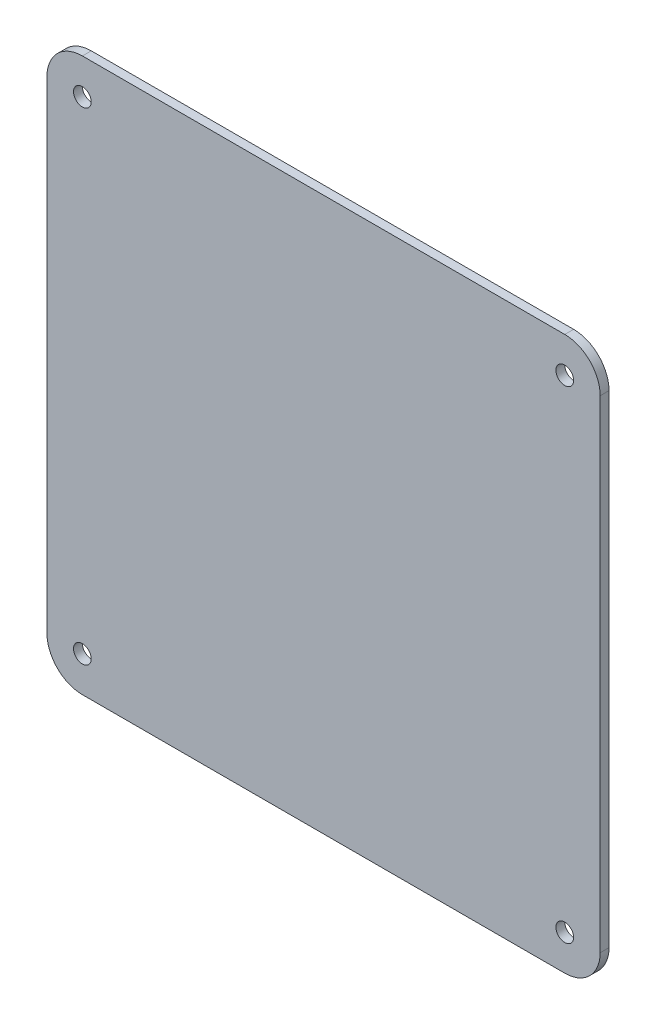
ISO-10303-21;
HEADER;
FILE_DESCRIPTION(('STEP AP214'),'2;1');
FILE_NAME('part.step','',(''),(''),'','','');
FILE_SCHEMA(('AUTOMOTIVE_DESIGN { 1 0 10303 214 1 1 1 1 }'));
ENDSEC;
DATA;
#1=APPLICATION_CONTEXT('core data for automotive mechanical design processes');
#2=APPLICATION_PROTOCOL_DEFINITION('international standard','automotive_design',2000,#1);
#3=PRODUCT_CONTEXT('',#1,'mechanical');
#4=PRODUCT('Part','Part','',(#3));
#5=PRODUCT_RELATED_PRODUCT_CATEGORY('part','',(#4));
#6=PRODUCT_DEFINITION_FORMATION('','',#4);
#7=PRODUCT_DEFINITION_CONTEXT('part definition',#1,'design');
#8=PRODUCT_DEFINITION('design','',#6,#7);
#9=PRODUCT_DEFINITION_SHAPE('','',#8);
#10=(LENGTH_UNIT() NAMED_UNIT(*) SI_UNIT(.MILLI.,.METRE.));
#11=(NAMED_UNIT(*) PLANE_ANGLE_UNIT() SI_UNIT($,.RADIAN.));
#12=(NAMED_UNIT(*) SI_UNIT($,.STERADIAN.) SOLID_ANGLE_UNIT());
#13=UNCERTAINTY_MEASURE_WITH_UNIT(LENGTH_MEASURE(1.E-05),#10,'distance_accuracy_value','');
#14=(GEOMETRIC_REPRESENTATION_CONTEXT(3) GLOBAL_UNCERTAINTY_ASSIGNED_CONTEXT((#13)) GLOBAL_UNIT_ASSIGNED_CONTEXT((#10,
#11,#12)) REPRESENTATION_CONTEXT('',''));
#15=CARTESIAN_POINT('',(0.,0.,0.));
#16=DIRECTION('',(0.,0.,1.));
#17=DIRECTION('',(1.,0.,0.));
#18=AXIS2_PLACEMENT_3D('',#15,#16,#17);
#19=CARTESIAN_POINT('',(-109.,-109.,4.));
#20=DIRECTION('',(0.,0.,1.));
#21=DIRECTION('',(1.,0.,0.));
#22=AXIS2_PLACEMENT_3D('',#19,#20,#21);
#23=PLANE('',#22);
#24=CARTESIAN_POINT('',(109.,109.,4.));
#25=DIRECTION('',(0.,0.,1.));
#26=DIRECTION('',(1.,0.,0.));
#27=AXIS2_PLACEMENT_3D('',#24,#25,#26);
#28=CIRCLE('',#27,4.00000000000001);
#29=CARTESIAN_POINT('',(113.,109.,4.));
#30=VERTEX_POINT('',#29);
#31=EDGE_CURVE('E188',#30,#30,#28,.T.);
#32=ORIENTED_EDGE('',*,*,#31,.F.);
#33=EDGE_LOOP('',(#32));
#34=FACE_BOUND('',#33,.T.);
#35=CARTESIAN_POINT('',(-109.,-109.,4.));
#36=DIRECTION('',(0.,0.,1.));
#37=DIRECTION('',(1.,0.,0.));
#38=AXIS2_PLACEMENT_3D('',#35,#36,#37);
#39=CIRCLE('',#38,4.00000000000001);
#40=CARTESIAN_POINT('',(-105.,-109.,4.));
#41=VERTEX_POINT('',#40);
#42=EDGE_CURVE('E134',#41,#41,#39,.T.);
#43=ORIENTED_EDGE('',*,*,#42,.F.);
#44=EDGE_LOOP('',(#43));
#45=FACE_BOUND('',#44,.T.);
#46=CARTESIAN_POINT('',(-109.,-109.,4.));
#47=DIRECTION('',(0.,0.,1.));
#48=DIRECTION('',(1.,0.,0.));
#49=AXIS2_PLACEMENT_3D('',#46,#47,#48);
#50=CIRCLE('',#49,16.);
#51=CARTESIAN_POINT('',(-125.,-109.,4.));
#52=VERTEX_POINT('',#51);
#53=CARTESIAN_POINT('',(-109.,-125.,4.));
#54=VERTEX_POINT('',#53);
#55=EDGE_CURVE('E145',#52,#54,#50,.T.);
#56=ORIENTED_EDGE('',*,*,#55,.T.);
#57=DIRECTION('',(1.,0.,0.));
#58=VECTOR('',#57,1.);
#59=CARTESIAN_POINT('',(-109.,-125.,4.));
#60=LINE('',#59,#58);
#61=CARTESIAN_POINT('',(109.,-125.,4.));
#62=VERTEX_POINT('',#61);
#63=EDGE_CURVE('E93',#54,#62,#60,.T.);
#64=ORIENTED_EDGE('',*,*,#63,.T.);
#65=CARTESIAN_POINT('',(109.,-109.,4.));
#66=DIRECTION('',(0.,0.,1.));
#67=DIRECTION('',(1.,0.,0.));
#68=AXIS2_PLACEMENT_3D('',#65,#66,#67);
#69=CIRCLE('',#68,16.);
#70=CARTESIAN_POINT('',(125.,-109.,4.));
#71=VERTEX_POINT('',#70);
#72=EDGE_CURVE('E160',#62,#71,#69,.T.);
#73=ORIENTED_EDGE('',*,*,#72,.T.);
#74=DIRECTION('',(0.,1.,0.));
#75=VECTOR('',#74,1.);
#76=CARTESIAN_POINT('',(125.,109.,4.));
#77=LINE('',#76,#75);
#78=CARTESIAN_POINT('',(125.,109.,4.));
#79=VERTEX_POINT('',#78);
#80=EDGE_CURVE('E173',#71,#79,#77,.T.);
#81=ORIENTED_EDGE('',*,*,#80,.T.);
#82=CARTESIAN_POINT('',(109.,109.,4.));
#83=DIRECTION('',(0.,0.,1.));
#84=DIRECTION('',(-1.,0.,0.));
#85=AXIS2_PLACEMENT_3D('',#82,#83,#84);
#86=CIRCLE('',#85,16.);
#87=CARTESIAN_POINT('',(109.,125.,4.));
#88=VERTEX_POINT('',#87);
#89=EDGE_CURVE('E112',#79,#88,#86,.T.);
#90=ORIENTED_EDGE('',*,*,#89,.T.);
#91=DIRECTION('',(-1.,0.,0.));
#92=VECTOR('',#91,1.);
#93=CARTESIAN_POINT('',(-109.,125.,4.));
#94=LINE('',#93,#92);
#95=CARTESIAN_POINT('',(-109.,125.,4.));
#96=VERTEX_POINT('',#95);
#97=EDGE_CURVE('E106',#88,#96,#94,.T.);
#98=ORIENTED_EDGE('',*,*,#97,.T.);
#99=CARTESIAN_POINT('',(-109.,109.,4.));
#100=DIRECTION('',(0.,0.,1.));
#101=DIRECTION('',(1.,0.,0.));
#102=AXIS2_PLACEMENT_3D('',#99,#100,#101);
#103=CIRCLE('',#102,16.);
#104=CARTESIAN_POINT('',(-125.,109.,4.));
#105=VERTEX_POINT('',#104);
#106=EDGE_CURVE('E110',#96,#105,#103,.T.);
#107=ORIENTED_EDGE('',*,*,#106,.T.);
#108=DIRECTION('',(0.,-1.,0.));
#109=VECTOR('',#108,1.);
#110=CARTESIAN_POINT('',(-125.,109.,4.));
#111=LINE('',#110,#109);
#112=EDGE_CURVE('E50',#105,#52,#111,.T.);
#113=ORIENTED_EDGE('',*,*,#112,.T.);
#114=EDGE_LOOP('',(#56,#64,#73,#81,#90,#98,#107,#113));
#115=FACE_BOUND('',#114,.T.);
#116=CARTESIAN_POINT('',(-109.,109.,4.));
#117=DIRECTION('',(0.,0.,1.));
#118=DIRECTION('',(1.,0.,0.));
#119=AXIS2_PLACEMENT_3D('',#116,#117,#118);
#120=CIRCLE('',#119,4.00000000000001);
#121=CARTESIAN_POINT('',(-105.,109.,4.));
#122=VERTEX_POINT('',#121);
#123=EDGE_CURVE('E182',#122,#122,#120,.T.);
#124=ORIENTED_EDGE('',*,*,#123,.F.);
#125=EDGE_LOOP('',(#124));
#126=FACE_BOUND('',#125,.T.);
#127=CARTESIAN_POINT('',(109.,-109.,4.));
#128=DIRECTION('',(0.,0.,1.));
#129=DIRECTION('',(1.,0.,0.));
#130=AXIS2_PLACEMENT_3D('',#127,#128,#129);
#131=CIRCLE('',#130,4.00000000000001);
#132=CARTESIAN_POINT('',(113.,-109.,4.));
#133=VERTEX_POINT('',#132);
#134=EDGE_CURVE('E194',#133,#133,#131,.T.);
#135=ORIENTED_EDGE('',*,*,#134,.F.);
#136=EDGE_LOOP('',(#135));
#137=FACE_BOUND('',#136,.T.);
#138=ADVANCED_FACE('F33',(#34,#45,#115,#126,#137),#23,.T.);
#139=CARTESIAN_POINT('',(-109.,-109.,0.));
#140=DIRECTION('',(0.,0.,1.));
#141=DIRECTION('',(1.,0.,0.));
#142=AXIS2_PLACEMENT_3D('',#139,#140,#141);
#143=PLANE('',#142);
#144=CARTESIAN_POINT('',(-109.,-109.,0.));
#145=DIRECTION('',(0.,0.,1.));
#146=DIRECTION('',(1.,0.,0.));
#147=AXIS2_PLACEMENT_3D('',#144,#145,#146);
#148=CIRCLE('',#147,16.);
#149=CARTESIAN_POINT('',(-125.,-109.,0.));
#150=VERTEX_POINT('',#149);
#151=CARTESIAN_POINT('',(-109.,-125.,0.));
#152=VERTEX_POINT('',#151);
#153=EDGE_CURVE('E130',#150,#152,#148,.T.);
#154=ORIENTED_EDGE('',*,*,#153,.F.);
#155=DIRECTION('',(0.,-1.,0.));
#156=VECTOR('',#155,1.);
#157=CARTESIAN_POINT('',(-125.,109.,0.));
#158=LINE('',#157,#156);
#159=CARTESIAN_POINT('',(-125.,109.,0.));
#160=VERTEX_POINT('',#159);
#161=EDGE_CURVE('E85',#160,#150,#158,.T.);
#162=ORIENTED_EDGE('',*,*,#161,.F.);
#163=CARTESIAN_POINT('',(-109.,109.,0.));
#164=DIRECTION('',(0.,0.,1.));
#165=DIRECTION('',(1.,0.,0.));
#166=AXIS2_PLACEMENT_3D('',#163,#164,#165);
#167=CIRCLE('',#166,16.);
#168=CARTESIAN_POINT('',(-109.,125.,0.));
#169=VERTEX_POINT('',#168);
#170=EDGE_CURVE('E79',#169,#160,#167,.T.);
#171=ORIENTED_EDGE('',*,*,#170,.F.);
#172=DIRECTION('',(-1.,0.,0.));
#173=VECTOR('',#172,1.);
#174=CARTESIAN_POINT('',(-109.,125.,0.));
#175=LINE('',#174,#173);
#176=CARTESIAN_POINT('',(109.,125.,0.));
#177=VERTEX_POINT('',#176);
#178=EDGE_CURVE('E120',#177,#169,#175,.T.);
#179=ORIENTED_EDGE('',*,*,#178,.F.);
#180=CARTESIAN_POINT('',(109.,109.,0.));
#181=DIRECTION('',(0.,0.,1.));
#182=DIRECTION('',(-1.,0.,0.));
#183=AXIS2_PLACEMENT_3D('',#180,#181,#182);
#184=CIRCLE('',#183,16.);
#185=CARTESIAN_POINT('',(125.,109.,0.));
#186=VERTEX_POINT('',#185);
#187=EDGE_CURVE('E140',#186,#177,#184,.T.);
#188=ORIENTED_EDGE('',*,*,#187,.F.);
#189=DIRECTION('',(0.,1.,0.));
#190=VECTOR('',#189,1.);
#191=CARTESIAN_POINT('',(125.,109.,0.));
#192=LINE('',#191,#190);
#193=CARTESIAN_POINT('',(125.,-109.,0.));
#194=VERTEX_POINT('',#193);
#195=EDGE_CURVE('E138',#194,#186,#192,.T.);
#196=ORIENTED_EDGE('',*,*,#195,.F.);
#197=CARTESIAN_POINT('',(109.,-109.,0.));
#198=DIRECTION('',(0.,0.,1.));
#199=DIRECTION('',(1.,0.,0.));
#200=AXIS2_PLACEMENT_3D('',#197,#198,#199);
#201=CIRCLE('',#200,16.);
#202=CARTESIAN_POINT('',(109.,-125.,0.));
#203=VERTEX_POINT('',#202);
#204=EDGE_CURVE('E136',#203,#194,#201,.T.);
#205=ORIENTED_EDGE('',*,*,#204,.F.);
#206=DIRECTION('',(1.,0.,0.));
#207=VECTOR('',#206,1.);
#208=CARTESIAN_POINT('',(-109.,-125.,0.));
#209=LINE('',#208,#207);
#210=EDGE_CURVE('E133',#152,#203,#209,.T.);
#211=ORIENTED_EDGE('',*,*,#210,.F.);
#212=EDGE_LOOP('',(#154,#162,#171,#179,#188,#196,#205,#211));
#213=FACE_BOUND('',#212,.T.);
#214=CARTESIAN_POINT('',(-109.,-109.,0.));
#215=DIRECTION('',(0.,0.,1.));
#216=DIRECTION('',(1.,0.,0.));
#217=AXIS2_PLACEMENT_3D('',#214,#215,#216);
#218=CIRCLE('',#217,4.00000000000001);
#219=CARTESIAN_POINT('',(-105.,-109.,0.));
#220=VERTEX_POINT('',#219);
#221=EDGE_CURVE('E179',#220,#220,#218,.T.);
#222=ORIENTED_EDGE('',*,*,#221,.T.);
#223=EDGE_LOOP('',(#222));
#224=FACE_BOUND('',#223,.T.);
#225=CARTESIAN_POINT('',(-109.,109.,0.));
#226=DIRECTION('',(0.,0.,1.));
#227=DIRECTION('',(1.,0.,0.));
#228=AXIS2_PLACEMENT_3D('',#225,#226,#227);
#229=CIRCLE('',#228,4.00000000000001);
#230=CARTESIAN_POINT('',(-105.,109.,0.));
#231=VERTEX_POINT('',#230);
#232=EDGE_CURVE('E185',#231,#231,#229,.T.);
#233=ORIENTED_EDGE('',*,*,#232,.T.);
#234=EDGE_LOOP('',(#233));
#235=FACE_BOUND('',#234,.T.);
#236=CARTESIAN_POINT('',(109.,109.,0.));
#237=DIRECTION('',(0.,0.,1.));
#238=DIRECTION('',(1.,0.,0.));
#239=AXIS2_PLACEMENT_3D('',#236,#237,#238);
#240=CIRCLE('',#239,4.00000000000001);
#241=CARTESIAN_POINT('',(113.,109.,0.));
#242=VERTEX_POINT('',#241);
#243=EDGE_CURVE('E191',#242,#242,#240,.T.);
#244=ORIENTED_EDGE('',*,*,#243,.T.);
#245=EDGE_LOOP('',(#244));
#246=FACE_BOUND('',#245,.T.);
#247=CARTESIAN_POINT('',(109.,-109.,0.));
#248=DIRECTION('',(0.,0.,1.));
#249=DIRECTION('',(1.,0.,0.));
#250=AXIS2_PLACEMENT_3D('',#247,#248,#249);
#251=CIRCLE('',#250,4.00000000000001);
#252=CARTESIAN_POINT('',(113.,-109.,0.));
#253=VERTEX_POINT('',#252);
#254=EDGE_CURVE('E197',#253,#253,#251,.T.);
#255=ORIENTED_EDGE('',*,*,#254,.T.);
#256=EDGE_LOOP('',(#255));
#257=FACE_BOUND('',#256,.T.);
#258=ADVANCED_FACE('F164',(#213,#224,#235,#246,#257),#143,.F.);
#259=CARTESIAN_POINT('',(-109.,-109.,4.));
#260=DIRECTION('',(0.,0.,-1.));
#261=DIRECTION('',(-1.,0.,0.));
#262=AXIS2_PLACEMENT_3D('',#259,#260,#261);
#263=CYLINDRICAL_SURFACE('',#262,16.);
#264=ORIENTED_EDGE('',*,*,#153,.T.);
#265=DIRECTION('',(0.,0.,-1.));
#266=VECTOR('',#265,1.);
#267=CARTESIAN_POINT('',(-109.,-125.,4.));
#268=LINE('',#267,#266);
#269=EDGE_CURVE('E11',#54,#152,#268,.T.);
#270=ORIENTED_EDGE('',*,*,#269,.F.);
#271=ORIENTED_EDGE('',*,*,#55,.F.);
#272=DIRECTION('',(0.,0.,-1.));
#273=VECTOR('',#272,1.);
#274=CARTESIAN_POINT('',(-125.,-109.,4.));
#275=LINE('',#274,#273);
#276=EDGE_CURVE('E126',#52,#150,#275,.T.);
#277=ORIENTED_EDGE('',*,*,#276,.T.);
#278=EDGE_LOOP('',(#264,#270,#271,#277));
#279=FACE_BOUND('',#278,.T.);
#280=ADVANCED_FACE('F35',(#279),#263,.T.);
#281=CARTESIAN_POINT('',(-109.,-125.,4.));
#282=DIRECTION('',(0.,1.,0.));
#283=DIRECTION('',(0.,0.,1.));
#284=AXIS2_PLACEMENT_3D('',#281,#282,#283);
#285=PLANE('',#284);
#286=ORIENTED_EDGE('',*,*,#210,.T.);
#287=DIRECTION('',(0.,0.,-1.));
#288=VECTOR('',#287,1.);
#289=CARTESIAN_POINT('',(109.,-125.,4.));
#290=LINE('',#289,#288);
#291=EDGE_CURVE('E42',#62,#203,#290,.T.);
#292=ORIENTED_EDGE('',*,*,#291,.F.);
#293=ORIENTED_EDGE('',*,*,#63,.F.);
#294=ORIENTED_EDGE('',*,*,#269,.T.);
#295=EDGE_LOOP('',(#286,#292,#293,#294));
#296=FACE_BOUND('',#295,.T.);
#297=ADVANCED_FACE('F231',(#296),#285,.F.);
#298=CARTESIAN_POINT('',(109.,-109.,4.));
#299=DIRECTION('',(0.,0.,-1.));
#300=DIRECTION('',(-1.,0.,0.));
#301=AXIS2_PLACEMENT_3D('',#298,#299,#300);
#302=CYLINDRICAL_SURFACE('',#301,16.);
#303=ORIENTED_EDGE('',*,*,#204,.T.);
#304=DIRECTION('',(0.,0.,-1.));
#305=VECTOR('',#304,1.);
#306=CARTESIAN_POINT('',(125.,-109.,4.));
#307=LINE('',#306,#305);
#308=EDGE_CURVE('E152',#71,#194,#307,.T.);
#309=ORIENTED_EDGE('',*,*,#308,.F.);
#310=ORIENTED_EDGE('',*,*,#72,.F.);
#311=ORIENTED_EDGE('',*,*,#291,.T.);
#312=EDGE_LOOP('',(#303,#309,#310,#311));
#313=FACE_BOUND('',#312,.T.);
#314=ADVANCED_FACE('F158',(#313),#302,.T.);
#315=CARTESIAN_POINT('',(125.,109.,4.));
#316=DIRECTION('',(-1.,0.,0.));
#317=DIRECTION('',(0.,-1.,0.));
#318=AXIS2_PLACEMENT_3D('',#315,#316,#317);
#319=PLANE('',#318);
#320=ORIENTED_EDGE('',*,*,#195,.T.);
#321=DIRECTION('',(0.,0.,-1.));
#322=VECTOR('',#321,1.);
#323=CARTESIAN_POINT('',(125.,109.,4.));
#324=LINE('',#323,#322);
#325=EDGE_CURVE('E149',#79,#186,#324,.T.);
#326=ORIENTED_EDGE('',*,*,#325,.F.);
#327=ORIENTED_EDGE('',*,*,#80,.F.);
#328=ORIENTED_EDGE('',*,*,#308,.T.);
#329=EDGE_LOOP('',(#320,#326,#327,#328));
#330=FACE_BOUND('',#329,.T.);
#331=ADVANCED_FACE('F169',(#330),#319,.F.);
#332=CARTESIAN_POINT('',(109.,109.,4.));
#333=DIRECTION('',(0.,0.,-1.));
#334=DIRECTION('',(-1.,0.,0.));
#335=AXIS2_PLACEMENT_3D('',#332,#333,#334);
#336=CYLINDRICAL_SURFACE('',#335,16.);
#337=ORIENTED_EDGE('',*,*,#187,.T.);
#338=DIRECTION('',(0.,0.,-1.));
#339=VECTOR('',#338,1.);
#340=CARTESIAN_POINT('',(109.,125.,4.));
#341=LINE('',#340,#339);
#342=EDGE_CURVE('E121',#88,#177,#341,.T.);
#343=ORIENTED_EDGE('',*,*,#342,.F.);
#344=ORIENTED_EDGE('',*,*,#89,.F.);
#345=ORIENTED_EDGE('',*,*,#325,.T.);
#346=EDGE_LOOP('',(#337,#343,#344,#345));
#347=FACE_BOUND('',#346,.T.);
#348=ADVANCED_FACE('F172',(#347),#336,.T.);
#349=CARTESIAN_POINT('',(-109.,125.,4.));
#350=DIRECTION('',(0.,-1.,0.));
#351=DIRECTION('',(0.,0.,-1.));
#352=AXIS2_PLACEMENT_3D('',#349,#350,#351);
#353=PLANE('',#352);
#354=ORIENTED_EDGE('',*,*,#178,.T.);
#355=DIRECTION('',(0.,0.,-1.));
#356=VECTOR('',#355,1.);
#357=CARTESIAN_POINT('',(-109.,125.,4.));
#358=LINE('',#357,#356);
#359=EDGE_CURVE('E117',#96,#169,#358,.T.);
#360=ORIENTED_EDGE('',*,*,#359,.F.);
#361=ORIENTED_EDGE('',*,*,#97,.F.);
#362=ORIENTED_EDGE('',*,*,#342,.T.);
#363=EDGE_LOOP('',(#354,#360,#361,#362));
#364=FACE_BOUND('',#363,.T.);
#365=ADVANCED_FACE('F118',(#364),#353,.F.);
#366=CARTESIAN_POINT('',(-109.,109.,4.));
#367=DIRECTION('',(0.,0.,-1.));
#368=DIRECTION('',(-1.,0.,0.));
#369=AXIS2_PLACEMENT_3D('',#366,#367,#368);
#370=CYLINDRICAL_SURFACE('',#369,16.);
#371=ORIENTED_EDGE('',*,*,#170,.T.);
#372=DIRECTION('',(0.,0.,-1.));
#373=VECTOR('',#372,1.);
#374=CARTESIAN_POINT('',(-125.,109.,4.));
#375=LINE('',#374,#373);
#376=EDGE_CURVE('E122',#105,#160,#375,.T.);
#377=ORIENTED_EDGE('',*,*,#376,.F.);
#378=ORIENTED_EDGE('',*,*,#106,.F.);
#379=ORIENTED_EDGE('',*,*,#359,.T.);
#380=EDGE_LOOP('',(#371,#377,#378,#379));
#381=FACE_BOUND('',#380,.T.);
#382=ADVANCED_FACE('F124',(#381),#370,.T.);
#383=CARTESIAN_POINT('',(-125.,109.,4.));
#384=DIRECTION('',(1.,0.,0.));
#385=DIRECTION('',(0.,1.,0.));
#386=AXIS2_PLACEMENT_3D('',#383,#384,#385);
#387=PLANE('',#386);
#388=ORIENTED_EDGE('',*,*,#161,.T.);
#389=ORIENTED_EDGE('',*,*,#276,.F.);
#390=ORIENTED_EDGE('',*,*,#112,.F.);
#391=ORIENTED_EDGE('',*,*,#376,.T.);
#392=EDGE_LOOP('',(#388,#389,#390,#391));
#393=FACE_BOUND('',#392,.T.);
#394=ADVANCED_FACE('F219',(#393),#387,.F.);
#395=CARTESIAN_POINT('',(-109.,-109.,4.));
#396=DIRECTION('',(0.,0.,-1.));
#397=DIRECTION('',(-1.,0.,0.));
#398=AXIS2_PLACEMENT_3D('',#395,#396,#397);
#399=CYLINDRICAL_SURFACE('',#398,4.00000000000001);
#400=ORIENTED_EDGE('',*,*,#42,.T.);
#401=EDGE_LOOP('',(#400));
#402=FACE_BOUND('',#401,.T.);
#403=ORIENTED_EDGE('',*,*,#221,.F.);
#404=EDGE_LOOP('',(#403));
#405=FACE_BOUND('',#404,.T.);
#406=ADVANCED_FACE('F216',(#402,#405),#399,.F.);
#407=CARTESIAN_POINT('',(-109.,109.,4.));
#408=DIRECTION('',(0.,0.,-1.));
#409=DIRECTION('',(-1.,0.,0.));
#410=AXIS2_PLACEMENT_3D('',#407,#408,#409);
#411=CYLINDRICAL_SURFACE('',#410,4.00000000000001);
#412=ORIENTED_EDGE('',*,*,#123,.T.);
#413=EDGE_LOOP('',(#412));
#414=FACE_BOUND('',#413,.T.);
#415=ORIENTED_EDGE('',*,*,#232,.F.);
#416=EDGE_LOOP('',(#415));
#417=FACE_BOUND('',#416,.T.);
#418=ADVANCED_FACE('F295',(#414,#417),#411,.F.);
#419=CARTESIAN_POINT('',(109.,109.,4.));
#420=DIRECTION('',(0.,0.,-1.));
#421=DIRECTION('',(-1.,0.,0.));
#422=AXIS2_PLACEMENT_3D('',#419,#420,#421);
#423=CYLINDRICAL_SURFACE('',#422,4.00000000000001);
#424=ORIENTED_EDGE('',*,*,#31,.T.);
#425=EDGE_LOOP('',(#424));
#426=FACE_BOUND('',#425,.T.);
#427=ORIENTED_EDGE('',*,*,#243,.F.);
#428=EDGE_LOOP('',(#427));
#429=FACE_BOUND('',#428,.T.);
#430=ADVANCED_FACE('F303',(#426,#429),#423,.F.);
#431=CARTESIAN_POINT('',(109.,-109.,4.));
#432=DIRECTION('',(0.,0.,-1.));
#433=DIRECTION('',(-1.,0.,0.));
#434=AXIS2_PLACEMENT_3D('',#431,#432,#433);
#435=CYLINDRICAL_SURFACE('',#434,4.00000000000001);
#436=ORIENTED_EDGE('',*,*,#134,.T.);
#437=EDGE_LOOP('',(#436));
#438=FACE_BOUND('',#437,.T.);
#439=ORIENTED_EDGE('',*,*,#254,.F.);
#440=EDGE_LOOP('',(#439));
#441=FACE_BOUND('',#440,.T.);
#442=ADVANCED_FACE('F203',(#438,#441),#435,.F.);
#443=CLOSED_SHELL('',(#138,#258,#280,#297,#314,#331,#348,#365,#382,#394,#406,#418,#430,#442));
#444=MANIFOLD_SOLID_BREP('B2',#443);
#445=ADVANCED_BREP_SHAPE_REPRESENTATION('',(#18,#444),#14);
#446=SHAPE_DEFINITION_REPRESENTATION(#9,#445);
ENDSEC;
END-ISO-10303-21;
